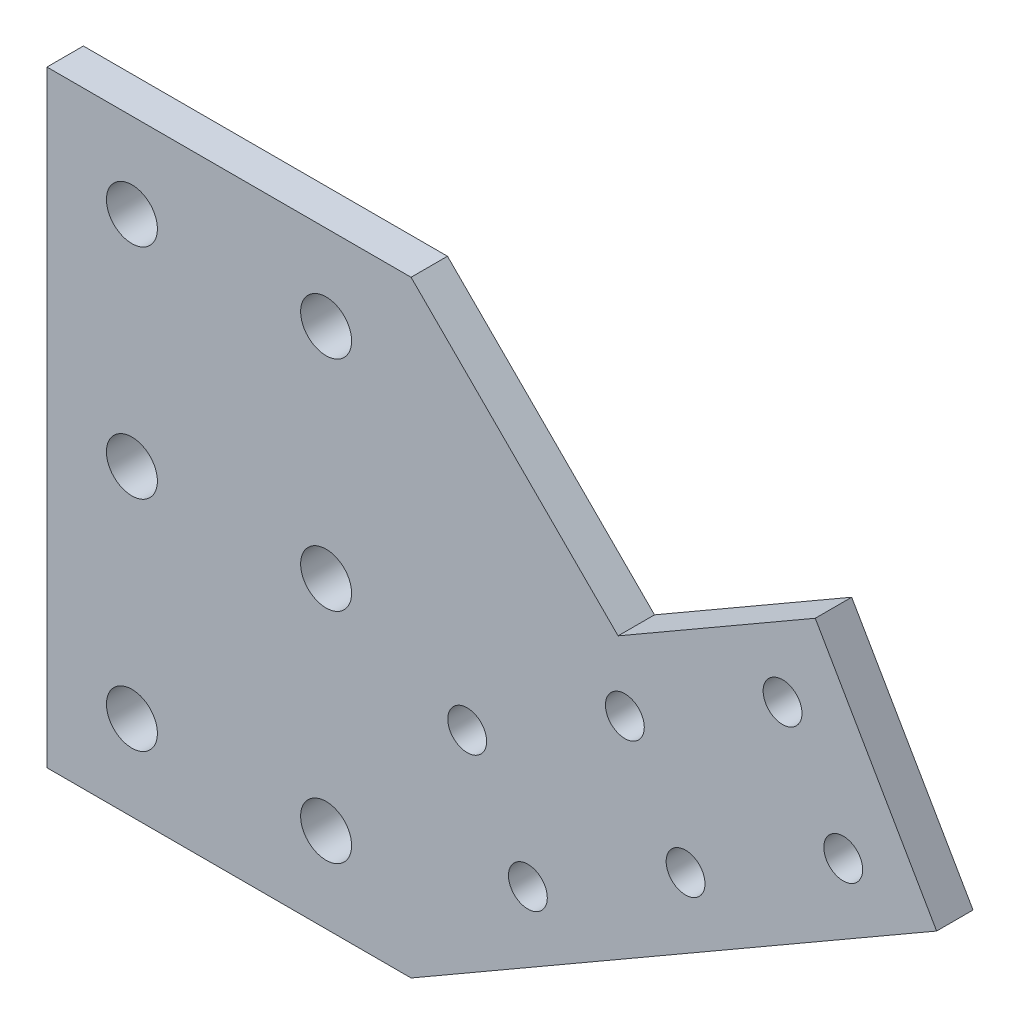
ISO-10303-21;
HEADER;
FILE_DESCRIPTION(('STEP AP214'),'2;1');
FILE_NAME('part.step','',(''),(''),'','','');
FILE_SCHEMA(('AUTOMOTIVE_DESIGN { 1 0 10303 214 1 1 1 1 }'));
ENDSEC;
DATA;
#1=APPLICATION_CONTEXT('core data for automotive mechanical design processes');
#2=APPLICATION_PROTOCOL_DEFINITION('international standard','automotive_design',2000,#1);
#3=PRODUCT_CONTEXT('',#1,'mechanical');
#4=PRODUCT('Part','Part','',(#3));
#5=PRODUCT_RELATED_PRODUCT_CATEGORY('part','',(#4));
#6=PRODUCT_DEFINITION_FORMATION('','',#4);
#7=PRODUCT_DEFINITION_CONTEXT('part definition',#1,'design');
#8=PRODUCT_DEFINITION('design','',#6,#7);
#9=PRODUCT_DEFINITION_SHAPE('','',#8);
#10=(LENGTH_UNIT() NAMED_UNIT(*) SI_UNIT(.MILLI.,.METRE.));
#11=(NAMED_UNIT(*) PLANE_ANGLE_UNIT() SI_UNIT($,.RADIAN.));
#12=(NAMED_UNIT(*) SI_UNIT($,.STERADIAN.) SOLID_ANGLE_UNIT());
#13=UNCERTAINTY_MEASURE_WITH_UNIT(LENGTH_MEASURE(1.E-05),#10,'distance_accuracy_value','');
#14=(GEOMETRIC_REPRESENTATION_CONTEXT(3) GLOBAL_UNCERTAINTY_ASSIGNED_CONTEXT((#13)) GLOBAL_UNIT_ASSIGNED_CONTEXT((#10,
#11,#12)) REPRESENTATION_CONTEXT('',''));
#15=CARTESIAN_POINT('',(0.,0.,0.));
#16=DIRECTION('',(0.,0.,1.));
#17=DIRECTION('',(1.,0.,0.));
#18=AXIS2_PLACEMENT_3D('',#15,#16,#17);
#19=CARTESIAN_POINT('',(43.301270189222,24.9999999999999,3.));
#20=DIRECTION('',(-0.499999999999998,0.86602540378444,0.));
#21=DIRECTION('',(-0.86602540378444,-0.499999999999998,0.));
#22=AXIS2_PLACEMENT_3D('',#19,#20,#21);
#23=PLANE('',#22);
#24=DIRECTION('',(0.86602540378444,0.499999999999998,0.));
#25=VECTOR('',#24,1.);
#26=CARTESIAN_POINT('',(43.301270189222,24.9999999999999,0.));
#27=LINE('',#26,#25);
#28=CARTESIAN_POINT('',(0.,0.,0.));
#29=VERTEX_POINT('',#28);
#30=CARTESIAN_POINT('',(43.301270189222,24.9999999999999,0.));
#31=VERTEX_POINT('',#30);
#32=EDGE_CURVE('E125',#29,#31,#27,.T.);
#33=ORIENTED_EDGE('',*,*,#32,.T.);
#34=DIRECTION('',(0.,0.,-1.));
#35=VECTOR('',#34,1.);
#36=CARTESIAN_POINT('',(43.301270189222,24.9999999999999,3.));
#37=LINE('',#36,#35);
#38=CARTESIAN_POINT('',(43.301270189222,24.9999999999999,3.));
#39=VERTEX_POINT('',#38);
#40=EDGE_CURVE('E11',#39,#31,#37,.T.);
#41=ORIENTED_EDGE('',*,*,#40,.F.);
#42=DIRECTION('',(0.86602540378444,0.499999999999998,0.));
#43=VECTOR('',#42,1.);
#44=CARTESIAN_POINT('',(43.301270189222,24.9999999999999,3.));
#45=LINE('',#44,#43);
#46=CARTESIAN_POINT('',(0.,0.,3.));
#47=VERTEX_POINT('',#46);
#48=EDGE_CURVE('E138',#47,#39,#45,.T.);
#49=ORIENTED_EDGE('',*,*,#48,.F.);
#50=DIRECTION('',(0.,0.,-1.));
#51=VECTOR('',#50,1.);
#52=CARTESIAN_POINT('',(0.,0.,3.));
#53=LINE('',#52,#51);
#54=EDGE_CURVE('E121',#47,#29,#53,.T.);
#55=ORIENTED_EDGE('',*,*,#54,.T.);
#56=EDGE_LOOP('',(#33,#41,#49,#55));
#57=FACE_BOUND('',#56,.T.);
#58=ADVANCED_FACE('F35',(#57),#23,.F.);
#59=CARTESIAN_POINT('',(33.301270189222,42.3205080756887,3.));
#60=DIRECTION('',(-0.86602540378444,-0.499999999999998,0.));
#61=DIRECTION('',(0.499999999999998,-0.86602540378444,0.));
#62=AXIS2_PLACEMENT_3D('',#59,#60,#61);
#63=PLANE('',#62);
#64=DIRECTION('',(-0.499999999999998,0.86602540378444,0.));
#65=VECTOR('',#64,1.);
#66=CARTESIAN_POINT('',(33.301270189222,42.3205080756887,0.));
#67=LINE('',#66,#65);
#68=CARTESIAN_POINT('',(33.301270189222,42.3205080756887,0.));
#69=VERTEX_POINT('',#68);
#70=EDGE_CURVE('E128',#31,#69,#67,.T.);
#71=ORIENTED_EDGE('',*,*,#70,.T.);
#72=DIRECTION('',(0.,0.,-1.));
#73=VECTOR('',#72,1.);
#74=CARTESIAN_POINT('',(33.301270189222,42.3205080756887,3.));
#75=LINE('',#74,#73);
#76=CARTESIAN_POINT('',(33.301270189222,42.3205080756887,3.));
#77=VERTEX_POINT('',#76);
#78=EDGE_CURVE('E43',#77,#69,#75,.T.);
#79=ORIENTED_EDGE('',*,*,#78,.F.);
#80=DIRECTION('',(-0.499999999999998,0.86602540378444,0.));
#81=VECTOR('',#80,1.);
#82=CARTESIAN_POINT('',(33.301270189222,42.3205080756887,3.));
#83=LINE('',#82,#81);
#84=EDGE_CURVE('E91',#39,#77,#83,.T.);
#85=ORIENTED_EDGE('',*,*,#84,.F.);
#86=ORIENTED_EDGE('',*,*,#40,.T.);
#87=EDGE_LOOP('',(#71,#79,#85,#86));
#88=FACE_BOUND('',#87,.T.);
#89=ADVANCED_FACE('F271',(#88),#63,.F.);
#90=CARTESIAN_POINT('',(17.0577136594005,32.9422863405994,3.));
#91=DIRECTION('',(0.499999999999998,-0.86602540378444,0.));
#92=DIRECTION('',(0.86602540378444,0.499999999999998,0.));
#93=AXIS2_PLACEMENT_3D('',#90,#91,#92);
#94=PLANE('',#93);
#95=DIRECTION('',(-0.86602540378444,-0.499999999999998,0.));
#96=VECTOR('',#95,1.);
#97=CARTESIAN_POINT('',(17.0577136594005,32.9422863405994,0.));
#98=LINE('',#97,#96);
#99=CARTESIAN_POINT('',(17.0577136594005,32.9422863405994,0.));
#100=VERTEX_POINT('',#99);
#101=EDGE_CURVE('E131',#69,#100,#98,.T.);
#102=ORIENTED_EDGE('',*,*,#101,.T.);
#103=DIRECTION('',(0.,0.,-1.));
#104=VECTOR('',#103,1.);
#105=CARTESIAN_POINT('',(17.0577136594005,32.9422863405994,3.));
#106=LINE('',#105,#104);
#107=CARTESIAN_POINT('',(17.0577136594005,32.9422863405994,3.));
#108=VERTEX_POINT('',#107);
#109=EDGE_CURVE('E142',#108,#100,#106,.T.);
#110=ORIENTED_EDGE('',*,*,#109,.F.);
#111=DIRECTION('',(-0.86602540378444,-0.499999999999998,0.));
#112=VECTOR('',#111,1.);
#113=CARTESIAN_POINT('',(17.0577136594005,32.9422863405994,3.));
#114=LINE('',#113,#112);
#115=EDGE_CURVE('E150',#77,#108,#114,.T.);
#116=ORIENTED_EDGE('',*,*,#115,.F.);
#117=ORIENTED_EDGE('',*,*,#78,.T.);
#118=EDGE_LOOP('',(#102,#110,#116,#117));
#119=FACE_BOUND('',#118,.T.);
#120=ADVANCED_FACE('F148',(#119),#94,.F.);
#121=CARTESIAN_POINT('',(0.,50.,3.));
#122=DIRECTION('',(-0.707106781186551,-0.707106781186544,0.));
#123=DIRECTION('',(0.707106781186544,-0.707106781186551,0.));
#124=AXIS2_PLACEMENT_3D('',#121,#122,#123);
#125=PLANE('',#124);
#126=DIRECTION('',(-0.707106781186544,0.707106781186551,0.));
#127=VECTOR('',#126,1.);
#128=CARTESIAN_POINT('',(0.,50.,0.));
#129=LINE('',#128,#127);
#130=CARTESIAN_POINT('',(0.,50.,0.));
#131=VERTEX_POINT('',#130);
#132=EDGE_CURVE('E133',#100,#131,#129,.T.);
#133=ORIENTED_EDGE('',*,*,#132,.T.);
#134=DIRECTION('',(0.,0.,-1.));
#135=VECTOR('',#134,1.);
#136=CARTESIAN_POINT('',(0.,50.,3.));
#137=LINE('',#136,#135);
#138=CARTESIAN_POINT('',(0.,50.,3.));
#139=VERTEX_POINT('',#138);
#140=EDGE_CURVE('E116',#139,#131,#137,.T.);
#141=ORIENTED_EDGE('',*,*,#140,.F.);
#142=DIRECTION('',(-0.707106781186544,0.707106781186551,0.));
#143=VECTOR('',#142,1.);
#144=CARTESIAN_POINT('',(0.,50.,3.));
#145=LINE('',#144,#143);
#146=EDGE_CURVE('E107',#108,#139,#145,.T.);
#147=ORIENTED_EDGE('',*,*,#146,.F.);
#148=ORIENTED_EDGE('',*,*,#109,.T.);
#149=EDGE_LOOP('',(#133,#141,#147,#148));
#150=FACE_BOUND('',#149,.T.);
#151=ADVANCED_FACE('F156',(#150),#125,.F.);
#152=CARTESIAN_POINT('',(-30.,50.,3.));
#153=DIRECTION('',(0.,-1.,0.));
#154=DIRECTION('',(0.,0.,-1.));
#155=AXIS2_PLACEMENT_3D('',#152,#153,#154);
#156=PLANE('',#155);
#157=DIRECTION('',(-1.,0.,0.));
#158=VECTOR('',#157,1.);
#159=CARTESIAN_POINT('',(-30.,50.,0.));
#160=LINE('',#159,#158);
#161=CARTESIAN_POINT('',(-30.,50.,0.));
#162=VERTEX_POINT('',#161);
#163=EDGE_CURVE('E115',#131,#162,#160,.T.);
#164=ORIENTED_EDGE('',*,*,#163,.T.);
#165=DIRECTION('',(0.,0.,-1.));
#166=VECTOR('',#165,1.);
#167=CARTESIAN_POINT('',(-30.,50.,3.));
#168=LINE('',#167,#166);
#169=CARTESIAN_POINT('',(-30.,50.,3.));
#170=VERTEX_POINT('',#169);
#171=EDGE_CURVE('E112',#170,#162,#168,.T.);
#172=ORIENTED_EDGE('',*,*,#171,.F.);
#173=DIRECTION('',(-1.,0.,0.));
#174=VECTOR('',#173,1.);
#175=CARTESIAN_POINT('',(-30.,50.,3.));
#176=LINE('',#175,#174);
#177=EDGE_CURVE('E101',#139,#170,#176,.T.);
#178=ORIENTED_EDGE('',*,*,#177,.F.);
#179=ORIENTED_EDGE('',*,*,#140,.T.);
#180=EDGE_LOOP('',(#164,#172,#178,#179));
#181=FACE_BOUND('',#180,.T.);
#182=ADVANCED_FACE('F113',(#181),#156,.F.);
#183=CARTESIAN_POINT('',(-30.,0.,3.));
#184=DIRECTION('',(1.,0.,0.));
#185=DIRECTION('',(0.,0.,-1.));
#186=AXIS2_PLACEMENT_3D('',#183,#184,#185);
#187=PLANE('',#186);
#188=DIRECTION('',(0.,-1.,0.));
#189=VECTOR('',#188,1.);
#190=CARTESIAN_POINT('',(-30.,0.,0.));
#191=LINE('',#190,#189);
#192=CARTESIAN_POINT('',(-30.,0.,0.));
#193=VERTEX_POINT('',#192);
#194=EDGE_CURVE('E77',#162,#193,#191,.T.);
#195=ORIENTED_EDGE('',*,*,#194,.T.);
#196=DIRECTION('',(0.,0.,-1.));
#197=VECTOR('',#196,1.);
#198=CARTESIAN_POINT('',(-30.,0.,3.));
#199=LINE('',#198,#197);
#200=CARTESIAN_POINT('',(-30.,0.,3.));
#201=VERTEX_POINT('',#200);
#202=EDGE_CURVE('E117',#201,#193,#199,.T.);
#203=ORIENTED_EDGE('',*,*,#202,.F.);
#204=DIRECTION('',(0.,-1.,0.));
#205=VECTOR('',#204,1.);
#206=CARTESIAN_POINT('',(-30.,0.,3.));
#207=LINE('',#206,#205);
#208=EDGE_CURVE('E105',#170,#201,#207,.T.);
#209=ORIENTED_EDGE('',*,*,#208,.F.);
#210=ORIENTED_EDGE('',*,*,#171,.T.);
#211=EDGE_LOOP('',(#195,#203,#209,#210));
#212=FACE_BOUND('',#211,.T.);
#213=ADVANCED_FACE('F119',(#212),#187,.F.);
#214=CARTESIAN_POINT('',(0.,0.,3.));
#215=DIRECTION('',(0.,1.,0.));
#216=DIRECTION('',(-1.,0.,0.));
#217=AXIS2_PLACEMENT_3D('',#214,#215,#216);
#218=PLANE('',#217);
#219=DIRECTION('',(1.,0.,0.));
#220=VECTOR('',#219,1.);
#221=CARTESIAN_POINT('',(0.,0.,0.));
#222=LINE('',#221,#220);
#223=EDGE_CURVE('E83',#193,#29,#222,.T.);
#224=ORIENTED_EDGE('',*,*,#223,.T.);
#225=ORIENTED_EDGE('',*,*,#54,.F.);
#226=DIRECTION('',(1.,0.,0.));
#227=VECTOR('',#226,1.);
#228=CARTESIAN_POINT('',(0.,0.,3.));
#229=LINE('',#228,#227);
#230=EDGE_CURVE('E51',#201,#47,#229,.T.);
#231=ORIENTED_EDGE('',*,*,#230,.F.);
#232=ORIENTED_EDGE('',*,*,#202,.T.);
#233=EDGE_LOOP('',(#224,#225,#231,#232));
#234=FACE_BOUND('',#233,.T.);
#235=ADVANCED_FACE('F245',(#234),#218,.F.);
#236=CARTESIAN_POINT('',(0.,0.,3.));
#237=DIRECTION('',(0.,0.,1.));
#238=DIRECTION('',(1.,0.,0.));
#239=AXIS2_PLACEMENT_3D('',#236,#237,#238);
#240=PLANE('',#239);
#241=CARTESIAN_POINT('',(-7.,25.,3.));
#242=DIRECTION('',(0.,0.,1.));
#243=DIRECTION('',(1.,0.,0.));
#244=AXIS2_PLACEMENT_3D('',#241,#242,#243);
#245=CIRCLE('',#244,2.1);
#246=CARTESIAN_POINT('',(-4.9,25.,3.));
#247=VERTEX_POINT('',#246);
#248=EDGE_CURVE('E198',#247,#247,#245,.T.);
#249=ORIENTED_EDGE('',*,*,#248,.F.);
#250=EDGE_LOOP('',(#249));
#251=FACE_BOUND('',#250,.T.);
#252=CARTESIAN_POINT('',(30.6051177665153,34.9903810567666,3.));
#253=DIRECTION('',(0.,0.,1.));
#254=DIRECTION('',(1.,0.,0.));
#255=AXIS2_PLACEMENT_3D('',#252,#253,#254);
#256=CIRCLE('',#255,1.6);
#257=CARTESIAN_POINT('',(32.2051177665153,34.9903810567666,3.));
#258=VERTEX_POINT('',#257);
#259=EDGE_CURVE('E191',#258,#258,#256,.T.);
#260=ORIENTED_EDGE('',*,*,#259,.F.);
#261=EDGE_LOOP('',(#260));
#262=FACE_BOUND('',#261,.T.);
#263=CARTESIAN_POINT('',(35.6051177665153,26.3301270189222,3.));
#264=DIRECTION('',(0.,0.,1.));
#265=DIRECTION('',(1.,0.,0.));
#266=AXIS2_PLACEMENT_3D('',#263,#264,#265);
#267=CIRCLE('',#266,1.6);
#268=CARTESIAN_POINT('',(37.2051177665153,26.3301270189222,3.));
#269=VERTEX_POINT('',#268);
#270=EDGE_CURVE('E210',#269,#269,#267,.T.);
#271=ORIENTED_EDGE('',*,*,#270,.F.);
#272=EDGE_LOOP('',(#271));
#273=FACE_BOUND('',#272,.T.);
#274=CARTESIAN_POINT('',(22.6147367097487,18.8301270189222,3.));
#275=DIRECTION('',(0.,0.,1.));
#276=DIRECTION('',(1.,0.,0.));
#277=AXIS2_PLACEMENT_3D('',#274,#275,#276);
#278=CIRCLE('',#277,1.6);
#279=CARTESIAN_POINT('',(24.2147367097487,18.8301270189222,3.));
#280=VERTEX_POINT('',#279);
#281=EDGE_CURVE('E203',#280,#280,#278,.T.);
#282=ORIENTED_EDGE('',*,*,#281,.F.);
#283=EDGE_LOOP('',(#282));
#284=FACE_BOUND('',#283,.T.);
#285=CARTESIAN_POINT('',(-7.,43.,3.));
#286=DIRECTION('',(0.,0.,1.));
#287=DIRECTION('',(1.,0.,0.));
#288=AXIS2_PLACEMENT_3D('',#285,#286,#287);
#289=CIRCLE('',#288,2.1);
#290=CARTESIAN_POINT('',(-4.9,43.,3.));
#291=VERTEX_POINT('',#290);
#292=EDGE_CURVE('E174',#291,#291,#289,.T.);
#293=ORIENTED_EDGE('',*,*,#292,.F.);
#294=EDGE_LOOP('',(#293));
#295=FACE_BOUND('',#294,.T.);
#296=CARTESIAN_POINT('',(-23.,7.,3.));
#297=DIRECTION('',(0.,0.,1.));
#298=DIRECTION('',(1.,0.,0.));
#299=AXIS2_PLACEMENT_3D('',#296,#297,#298);
#300=CIRCLE('',#299,2.1);
#301=CARTESIAN_POINT('',(-20.9,7.,3.));
#302=VERTEX_POINT('',#301);
#303=EDGE_CURVE('E167',#302,#302,#300,.T.);
#304=ORIENTED_EDGE('',*,*,#303,.F.);
#305=EDGE_LOOP('',(#304));
#306=FACE_BOUND('',#305,.T.);
#307=CARTESIAN_POINT('',(-7.,7.,3.));
#308=DIRECTION('',(0.,0.,1.));
#309=DIRECTION('',(1.,0.,0.));
#310=AXIS2_PLACEMENT_3D('',#307,#308,#309);
#311=CIRCLE('',#310,2.1);
#312=CARTESIAN_POINT('',(-4.9,7.,3.));
#313=VERTEX_POINT('',#312);
#314=EDGE_CURVE('E186',#313,#313,#311,.T.);
#315=ORIENTED_EDGE('',*,*,#314,.F.);
#316=EDGE_LOOP('',(#315));
#317=FACE_BOUND('',#316,.T.);
#318=CARTESIAN_POINT('',(-23.,25.,3.));
#319=DIRECTION('',(0.,0.,1.));
#320=DIRECTION('',(1.,0.,0.));
#321=AXIS2_PLACEMENT_3D('',#318,#319,#320);
#322=CIRCLE('',#321,2.1);
#323=CARTESIAN_POINT('',(-20.9,25.,3.));
#324=VERTEX_POINT('',#323);
#325=EDGE_CURVE('E179',#324,#324,#322,.T.);
#326=ORIENTED_EDGE('',*,*,#325,.F.);
#327=EDGE_LOOP('',(#326));
#328=FACE_BOUND('',#327,.T.);
#329=CARTESIAN_POINT('',(17.6147367097487,27.4903810567666,3.));
#330=DIRECTION('',(0.,0.,1.));
#331=DIRECTION('',(1.,0.,0.));
#332=AXIS2_PLACEMENT_3D('',#329,#330,#331);
#333=CIRCLE('',#332,1.6);
#334=CARTESIAN_POINT('',(19.2147367097487,27.4903810567666,3.));
#335=VERTEX_POINT('',#334);
#336=EDGE_CURVE('E227',#335,#335,#333,.T.);
#337=ORIENTED_EDGE('',*,*,#336,.F.);
#338=EDGE_LOOP('',(#337));
#339=FACE_BOUND('',#338,.T.);
#340=CARTESIAN_POINT('',(4.62435565298215,19.9903810567666,3.));
#341=DIRECTION('',(0.,0.,1.));
#342=DIRECTION('',(1.,0.,0.));
#343=AXIS2_PLACEMENT_3D('',#340,#341,#342);
#344=CIRCLE('',#343,1.6);
#345=CARTESIAN_POINT('',(6.22435565298214,19.9903810567666,3.));
#346=VERTEX_POINT('',#345);
#347=EDGE_CURVE('E221',#346,#346,#344,.T.);
#348=ORIENTED_EDGE('',*,*,#347,.F.);
#349=EDGE_LOOP('',(#348));
#350=FACE_BOUND('',#349,.T.);
#351=CARTESIAN_POINT('',(9.62435565298215,11.3301270189222,3.));
#352=DIRECTION('',(0.,0.,1.));
#353=DIRECTION('',(1.,0.,0.));
#354=AXIS2_PLACEMENT_3D('',#351,#352,#353);
#355=CIRCLE('',#354,1.6);
#356=CARTESIAN_POINT('',(11.2243556529822,11.3301270189222,3.));
#357=VERTEX_POINT('',#356);
#358=EDGE_CURVE('E215',#357,#357,#355,.T.);
#359=ORIENTED_EDGE('',*,*,#358,.F.);
#360=EDGE_LOOP('',(#359));
#361=FACE_BOUND('',#360,.T.);
#362=CARTESIAN_POINT('',(-23.,43.,3.));
#363=DIRECTION('',(0.,0.,1.));
#364=DIRECTION('',(1.,0.,0.));
#365=AXIS2_PLACEMENT_3D('',#362,#363,#364);
#366=CIRCLE('',#365,2.1);
#367=CARTESIAN_POINT('',(-20.9,43.,3.));
#368=VERTEX_POINT('',#367);
#369=EDGE_CURVE('E161',#368,#368,#366,.T.);
#370=ORIENTED_EDGE('',*,*,#369,.F.);
#371=EDGE_LOOP('',(#370));
#372=FACE_BOUND('',#371,.T.);
#373=ORIENTED_EDGE('',*,*,#48,.T.);
#374=ORIENTED_EDGE('',*,*,#84,.T.);
#375=ORIENTED_EDGE('',*,*,#115,.T.);
#376=ORIENTED_EDGE('',*,*,#146,.T.);
#377=ORIENTED_EDGE('',*,*,#177,.T.);
#378=ORIENTED_EDGE('',*,*,#208,.T.);
#379=ORIENTED_EDGE('',*,*,#230,.T.);
#380=EDGE_LOOP('',(#373,#374,#375,#376,#377,#378,#379));
#381=FACE_BOUND('',#380,.T.);
#382=ADVANCED_FACE('F103',(#251,#262,#273,#284,#295,#306,#317,#328,#339,#350,#361,#372,#381),
#240,.T.);
#383=CARTESIAN_POINT('',(0.,0.,0.));
#384=DIRECTION('',(0.,0.,1.));
#385=DIRECTION('',(1.,0.,0.));
#386=AXIS2_PLACEMENT_3D('',#383,#384,#385);
#387=PLANE('',#386);
#388=CARTESIAN_POINT('',(-7.,25.,0.));
#389=DIRECTION('',(0.,0.,1.));
#390=DIRECTION('',(1.,0.,0.));
#391=AXIS2_PLACEMENT_3D('',#388,#389,#390);
#392=CIRCLE('',#391,2.1);
#393=CARTESIAN_POINT('',(-4.9,25.,0.));
#394=VERTEX_POINT('',#393);
#395=EDGE_CURVE('E183',#394,#394,#392,.T.);
#396=ORIENTED_EDGE('',*,*,#395,.T.);
#397=EDGE_LOOP('',(#396));
#398=FACE_BOUND('',#397,.T.);
#399=CARTESIAN_POINT('',(30.6051177665153,34.9903810567666,0.));
#400=DIRECTION('',(0.,0.,1.));
#401=DIRECTION('',(1.,0.,0.));
#402=AXIS2_PLACEMENT_3D('',#399,#400,#401);
#403=CIRCLE('',#402,1.6);
#404=CARTESIAN_POINT('',(32.2051177665153,34.9903810567666,0.));
#405=VERTEX_POINT('',#404);
#406=EDGE_CURVE('E194',#405,#405,#403,.T.);
#407=ORIENTED_EDGE('',*,*,#406,.T.);
#408=EDGE_LOOP('',(#407));
#409=FACE_BOUND('',#408,.T.);
#410=CARTESIAN_POINT('',(35.6051177665153,26.3301270189222,0.));
#411=DIRECTION('',(0.,0.,1.));
#412=DIRECTION('',(1.,0.,0.));
#413=AXIS2_PLACEMENT_3D('',#410,#411,#412);
#414=CIRCLE('',#413,1.6);
#415=CARTESIAN_POINT('',(37.2051177665153,26.3301270189222,0.));
#416=VERTEX_POINT('',#415);
#417=EDGE_CURVE('E195',#416,#416,#414,.T.);
#418=ORIENTED_EDGE('',*,*,#417,.T.);
#419=EDGE_LOOP('',(#418));
#420=FACE_BOUND('',#419,.T.);
#421=CARTESIAN_POINT('',(22.6147367097487,18.8301270189222,0.));
#422=DIRECTION('',(0.,0.,1.));
#423=DIRECTION('',(1.,0.,0.));
#424=AXIS2_PLACEMENT_3D('',#421,#422,#423);
#425=CIRCLE('',#424,1.6);
#426=CARTESIAN_POINT('',(24.2147367097487,18.8301270189222,0.));
#427=VERTEX_POINT('',#426);
#428=EDGE_CURVE('E206',#427,#427,#425,.T.);
#429=ORIENTED_EDGE('',*,*,#428,.T.);
#430=EDGE_LOOP('',(#429));
#431=FACE_BOUND('',#430,.T.);
#432=CARTESIAN_POINT('',(-7.,43.,0.));
#433=DIRECTION('',(0.,0.,1.));
#434=DIRECTION('',(1.,0.,0.));
#435=AXIS2_PLACEMENT_3D('',#432,#433,#434);
#436=CIRCLE('',#435,2.1);
#437=CARTESIAN_POINT('',(-4.9,43.,0.));
#438=VERTEX_POINT('',#437);
#439=EDGE_CURVE('E164',#438,#438,#436,.T.);
#440=ORIENTED_EDGE('',*,*,#439,.T.);
#441=EDGE_LOOP('',(#440));
#442=FACE_BOUND('',#441,.T.);
#443=CARTESIAN_POINT('',(-23.,7.,0.));
#444=DIRECTION('',(0.,0.,1.));
#445=DIRECTION('',(1.,0.,0.));
#446=AXIS2_PLACEMENT_3D('',#443,#444,#445);
#447=CIRCLE('',#446,2.1);
#448=CARTESIAN_POINT('',(-20.9,7.,0.));
#449=VERTEX_POINT('',#448);
#450=EDGE_CURVE('E170',#449,#449,#447,.T.);
#451=ORIENTED_EDGE('',*,*,#450,.T.);
#452=EDGE_LOOP('',(#451));
#453=FACE_BOUND('',#452,.T.);
#454=CARTESIAN_POINT('',(-7.,7.,0.));
#455=DIRECTION('',(0.,0.,1.));
#456=DIRECTION('',(1.,0.,0.));
#457=AXIS2_PLACEMENT_3D('',#454,#455,#456);
#458=CIRCLE('',#457,2.1);
#459=CARTESIAN_POINT('',(-4.9,7.,0.));
#460=VERTEX_POINT('',#459);
#461=EDGE_CURVE('E171',#460,#460,#458,.T.);
#462=ORIENTED_EDGE('',*,*,#461,.T.);
#463=EDGE_LOOP('',(#462));
#464=FACE_BOUND('',#463,.T.);
#465=CARTESIAN_POINT('',(-23.,25.,0.));
#466=DIRECTION('',(0.,0.,1.));
#467=DIRECTION('',(1.,0.,0.));
#468=AXIS2_PLACEMENT_3D('',#465,#466,#467);
#469=CIRCLE('',#468,2.1);
#470=CARTESIAN_POINT('',(-20.9,25.,0.));
#471=VERTEX_POINT('',#470);
#472=EDGE_CURVE('E182',#471,#471,#469,.T.);
#473=ORIENTED_EDGE('',*,*,#472,.T.);
#474=EDGE_LOOP('',(#473));
#475=FACE_BOUND('',#474,.T.);
#476=CARTESIAN_POINT('',(17.6147367097487,27.4903810567666,0.));
#477=DIRECTION('',(0.,0.,1.));
#478=DIRECTION('',(1.,0.,0.));
#479=AXIS2_PLACEMENT_3D('',#476,#477,#478);
#480=CIRCLE('',#479,1.6);
#481=CARTESIAN_POINT('',(19.2147367097487,27.4903810567666,0.));
#482=VERTEX_POINT('',#481);
#483=EDGE_CURVE('E207',#482,#482,#480,.T.);
#484=ORIENTED_EDGE('',*,*,#483,.T.);
#485=EDGE_LOOP('',(#484));
#486=FACE_BOUND('',#485,.T.);
#487=CARTESIAN_POINT('',(4.62435565298215,19.9903810567666,0.));
#488=DIRECTION('',(0.,0.,1.));
#489=DIRECTION('',(1.,0.,0.));
#490=AXIS2_PLACEMENT_3D('',#487,#488,#489);
#491=CIRCLE('',#490,1.6);
#492=CARTESIAN_POINT('',(6.22435565298214,19.9903810567666,0.));
#493=VERTEX_POINT('',#492);
#494=EDGE_CURVE('E224',#493,#493,#491,.T.);
#495=ORIENTED_EDGE('',*,*,#494,.T.);
#496=EDGE_LOOP('',(#495));
#497=FACE_BOUND('',#496,.T.);
#498=CARTESIAN_POINT('',(9.62435565298215,11.3301270189222,0.));
#499=DIRECTION('',(0.,0.,1.));
#500=DIRECTION('',(1.,0.,0.));
#501=AXIS2_PLACEMENT_3D('',#498,#499,#500);
#502=CIRCLE('',#501,1.6);
#503=CARTESIAN_POINT('',(11.2243556529822,11.3301270189222,0.));
#504=VERTEX_POINT('',#503);
#505=EDGE_CURVE('E218',#504,#504,#502,.T.);
#506=ORIENTED_EDGE('',*,*,#505,.T.);
#507=EDGE_LOOP('',(#506));
#508=FACE_BOUND('',#507,.T.);
#509=CARTESIAN_POINT('',(-23.,43.,0.));
#510=DIRECTION('',(0.,0.,1.));
#511=DIRECTION('',(1.,0.,0.));
#512=AXIS2_PLACEMENT_3D('',#509,#510,#511);
#513=CIRCLE('',#512,2.1);
#514=CARTESIAN_POINT('',(-20.9,43.,0.));
#515=VERTEX_POINT('',#514);
#516=EDGE_CURVE('E129',#515,#515,#513,.T.);
#517=ORIENTED_EDGE('',*,*,#516,.T.);
#518=EDGE_LOOP('',(#517));
#519=FACE_BOUND('',#518,.T.);
#520=ORIENTED_EDGE('',*,*,#32,.F.);
#521=ORIENTED_EDGE('',*,*,#223,.F.);
#522=ORIENTED_EDGE('',*,*,#194,.F.);
#523=ORIENTED_EDGE('',*,*,#163,.F.);
#524=ORIENTED_EDGE('',*,*,#132,.F.);
#525=ORIENTED_EDGE('',*,*,#101,.F.);
#526=ORIENTED_EDGE('',*,*,#70,.F.);
#527=EDGE_LOOP('',(#520,#521,#522,#523,#524,#525,#526));
#528=FACE_BOUND('',#527,.T.);
#529=ADVANCED_FACE('F154',(#398,#409,#420,#431,#442,#453,#464,#475,#486,#497,#508,#519,#528),
#387,.F.);
#530=CARTESIAN_POINT('',(-23.,43.,0.));
#531=DIRECTION('',(0.,0.,1.));
#532=DIRECTION('',(1.,0.,0.));
#533=AXIS2_PLACEMENT_3D('',#530,#531,#532);
#534=CYLINDRICAL_SURFACE('',#533,2.1);
#535=ORIENTED_EDGE('',*,*,#516,.F.);
#536=EDGE_LOOP('',(#535));
#537=FACE_BOUND('',#536,.T.);
#538=ORIENTED_EDGE('',*,*,#369,.T.);
#539=EDGE_LOOP('',(#538));
#540=FACE_BOUND('',#539,.T.);
#541=ADVANCED_FACE('F254',(#537,#540),#534,.F.);
#542=CARTESIAN_POINT('',(9.62435565298215,11.3301270189222,0.));
#543=DIRECTION('',(0.,0.,1.));
#544=DIRECTION('',(1.,0.,0.));
#545=AXIS2_PLACEMENT_3D('',#542,#543,#544);
#546=CYLINDRICAL_SURFACE('',#545,1.6);
#547=ORIENTED_EDGE('',*,*,#505,.F.);
#548=EDGE_LOOP('',(#547));
#549=FACE_BOUND('',#548,.T.);
#550=ORIENTED_EDGE('',*,*,#358,.T.);
#551=EDGE_LOOP('',(#550));
#552=FACE_BOUND('',#551,.T.);
#553=ADVANCED_FACE('F256',(#549,#552),#546,.F.);
#554=CARTESIAN_POINT('',(4.62435565298215,19.9903810567666,0.));
#555=DIRECTION('',(0.,0.,1.));
#556=DIRECTION('',(1.,0.,0.));
#557=AXIS2_PLACEMENT_3D('',#554,#555,#556);
#558=CYLINDRICAL_SURFACE('',#557,1.6);
#559=ORIENTED_EDGE('',*,*,#494,.F.);
#560=EDGE_LOOP('',(#559));
#561=FACE_BOUND('',#560,.T.);
#562=ORIENTED_EDGE('',*,*,#347,.T.);
#563=EDGE_LOOP('',(#562));
#564=FACE_BOUND('',#563,.T.);
#565=ADVANCED_FACE('F239',(#561,#564),#558,.F.);
#566=CARTESIAN_POINT('',(17.6147367097487,27.4903810567666,0.));
#567=DIRECTION('',(0.,0.,1.));
#568=DIRECTION('',(1.,0.,0.));
#569=AXIS2_PLACEMENT_3D('',#566,#567,#568);
#570=CYLINDRICAL_SURFACE('',#569,1.6);
#571=ORIENTED_EDGE('',*,*,#483,.F.);
#572=EDGE_LOOP('',(#571));
#573=FACE_BOUND('',#572,.T.);
#574=ORIENTED_EDGE('',*,*,#336,.T.);
#575=EDGE_LOOP('',(#574));
#576=FACE_BOUND('',#575,.T.);
#577=ADVANCED_FACE('F235',(#573,#576),#570,.F.);
#578=CARTESIAN_POINT('',(-23.,25.,0.));
#579=DIRECTION('',(0.,0.,1.));
#580=DIRECTION('',(1.,0.,0.));
#581=AXIS2_PLACEMENT_3D('',#578,#579,#580);
#582=CYLINDRICAL_SURFACE('',#581,2.1);
#583=ORIENTED_EDGE('',*,*,#472,.F.);
#584=EDGE_LOOP('',(#583));
#585=FACE_BOUND('',#584,.T.);
#586=ORIENTED_EDGE('',*,*,#325,.T.);
#587=EDGE_LOOP('',(#586));
#588=FACE_BOUND('',#587,.T.);
#589=ADVANCED_FACE('F238',(#585,#588),#582,.F.);
#590=CARTESIAN_POINT('',(-7.,7.,0.));
#591=DIRECTION('',(0.,0.,1.));
#592=DIRECTION('',(1.,0.,0.));
#593=AXIS2_PLACEMENT_3D('',#590,#591,#592);
#594=CYLINDRICAL_SURFACE('',#593,2.1);
#595=ORIENTED_EDGE('',*,*,#461,.F.);
#596=EDGE_LOOP('',(#595));
#597=FACE_BOUND('',#596,.T.);
#598=ORIENTED_EDGE('',*,*,#314,.T.);
#599=EDGE_LOOP('',(#598));
#600=FACE_BOUND('',#599,.T.);
#601=ADVANCED_FACE('F351',(#597,#600),#594,.F.);
#602=CARTESIAN_POINT('',(-23.,7.,0.));
#603=DIRECTION('',(0.,0.,1.));
#604=DIRECTION('',(1.,0.,0.));
#605=AXIS2_PLACEMENT_3D('',#602,#603,#604);
#606=CYLINDRICAL_SURFACE('',#605,2.1);
#607=ORIENTED_EDGE('',*,*,#450,.F.);
#608=EDGE_LOOP('',(#607));
#609=FACE_BOUND('',#608,.T.);
#610=ORIENTED_EDGE('',*,*,#303,.T.);
#611=EDGE_LOOP('',(#610));
#612=FACE_BOUND('',#611,.T.);
#613=ADVANCED_FACE('F361',(#609,#612),#606,.F.);
#614=CARTESIAN_POINT('',(-7.,43.,0.));
#615=DIRECTION('',(0.,0.,1.));
#616=DIRECTION('',(1.,0.,0.));
#617=AXIS2_PLACEMENT_3D('',#614,#615,#616);
#618=CYLINDRICAL_SURFACE('',#617,2.1);
#619=ORIENTED_EDGE('',*,*,#439,.F.);
#620=EDGE_LOOP('',(#619));
#621=FACE_BOUND('',#620,.T.);
#622=ORIENTED_EDGE('',*,*,#292,.T.);
#623=EDGE_LOOP('',(#622));
#624=FACE_BOUND('',#623,.T.);
#625=ADVANCED_FACE('F371',(#621,#624),#618,.F.);
#626=CARTESIAN_POINT('',(22.6147367097487,18.8301270189222,0.));
#627=DIRECTION('',(0.,0.,1.));
#628=DIRECTION('',(1.,0.,0.));
#629=AXIS2_PLACEMENT_3D('',#626,#627,#628);
#630=CYLINDRICAL_SURFACE('',#629,1.6);
#631=ORIENTED_EDGE('',*,*,#428,.F.);
#632=EDGE_LOOP('',(#631));
#633=FACE_BOUND('',#632,.T.);
#634=ORIENTED_EDGE('',*,*,#281,.T.);
#635=EDGE_LOOP('',(#634));
#636=FACE_BOUND('',#635,.T.);
#637=ADVANCED_FACE('F380',(#633,#636),#630,.F.);
#638=CARTESIAN_POINT('',(35.6051177665153,26.3301270189222,0.));
#639=DIRECTION('',(0.,0.,1.));
#640=DIRECTION('',(1.,0.,0.));
#641=AXIS2_PLACEMENT_3D('',#638,#639,#640);
#642=CYLINDRICAL_SURFACE('',#641,1.6);
#643=ORIENTED_EDGE('',*,*,#417,.F.);
#644=EDGE_LOOP('',(#643));
#645=FACE_BOUND('',#644,.T.);
#646=ORIENTED_EDGE('',*,*,#270,.T.);
#647=EDGE_LOOP('',(#646));
#648=FACE_BOUND('',#647,.T.);
#649=ADVANCED_FACE('F390',(#645,#648),#642,.F.);
#650=CARTESIAN_POINT('',(30.6051177665153,34.9903810567666,0.));
#651=DIRECTION('',(0.,0.,1.));
#652=DIRECTION('',(1.,0.,0.));
#653=AXIS2_PLACEMENT_3D('',#650,#651,#652);
#654=CYLINDRICAL_SURFACE('',#653,1.6);
#655=ORIENTED_EDGE('',*,*,#406,.F.);
#656=EDGE_LOOP('',(#655));
#657=FACE_BOUND('',#656,.T.);
#658=ORIENTED_EDGE('',*,*,#259,.T.);
#659=EDGE_LOOP('',(#658));
#660=FACE_BOUND('',#659,.T.);
#661=ADVANCED_FACE('F400',(#657,#660),#654,.F.);
#662=CARTESIAN_POINT('',(-7.,25.,0.));
#663=DIRECTION('',(0.,0.,1.));
#664=DIRECTION('',(1.,0.,0.));
#665=AXIS2_PLACEMENT_3D('',#662,#663,#664);
#666=CYLINDRICAL_SURFACE('',#665,2.1);
#667=ORIENTED_EDGE('',*,*,#395,.F.);
#668=EDGE_LOOP('',(#667));
#669=FACE_BOUND('',#668,.T.);
#670=ORIENTED_EDGE('',*,*,#248,.T.);
#671=EDGE_LOOP('',(#670));
#672=FACE_BOUND('',#671,.T.);
#673=ADVANCED_FACE('F410',(#669,#672),#666,.F.);
#674=CLOSED_SHELL('',(#58,#89,#120,#151,#182,#213,#235,#382,#529,#541,#553,#565,#577,#589,#601,
#613,#625,#637,#649,#661,#673));
#675=MANIFOLD_SOLID_BREP('B2',#674);
#676=ADVANCED_BREP_SHAPE_REPRESENTATION('',(#18,#675),#14);
#677=SHAPE_DEFINITION_REPRESENTATION(#9,#676);
ENDSEC;
END-ISO-10303-21;
